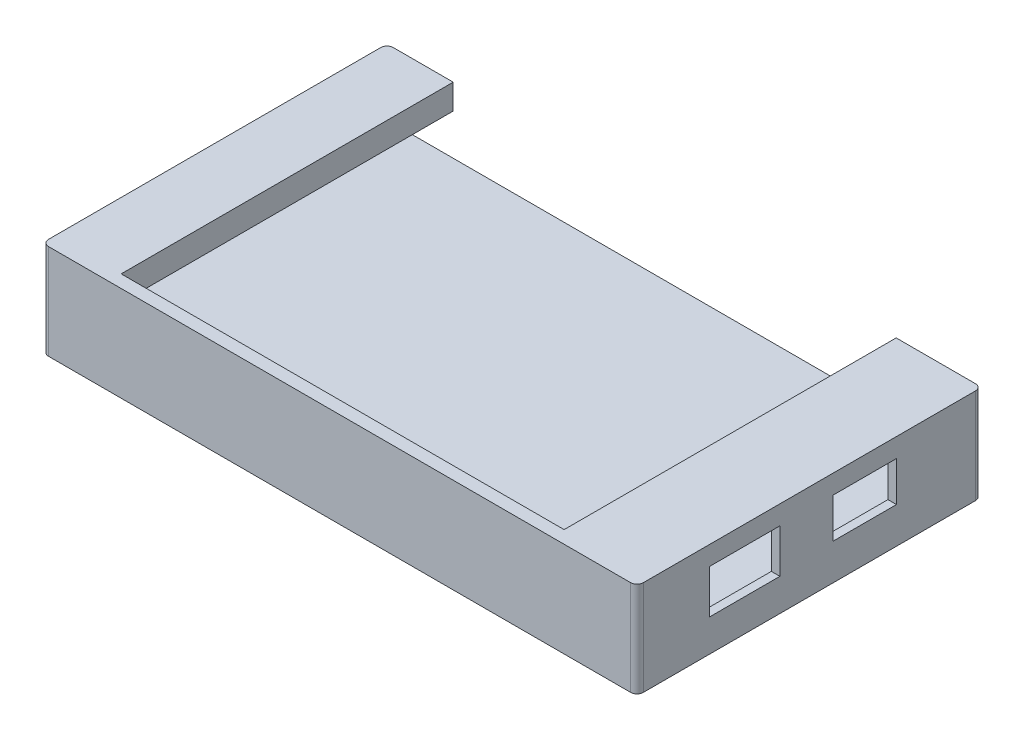
ISO-10303-21;
HEADER;
FILE_DESCRIPTION(('STEP AP214'),'2;1');
FILE_NAME('part.step','',(''),(''),'','','');
FILE_SCHEMA(('AUTOMOTIVE_DESIGN { 1 0 10303 214 1 1 1 1 }'));
ENDSEC;
DATA;
#1=APPLICATION_CONTEXT('core data for automotive mechanical design processes');
#2=APPLICATION_PROTOCOL_DEFINITION('international standard','automotive_design',2000,#1);
#3=PRODUCT_CONTEXT('',#1,'mechanical');
#4=PRODUCT('Part','Part','',(#3));
#5=PRODUCT_RELATED_PRODUCT_CATEGORY('part','',(#4));
#6=PRODUCT_DEFINITION_FORMATION('','',#4);
#7=PRODUCT_DEFINITION_CONTEXT('part definition',#1,'design');
#8=PRODUCT_DEFINITION('design','',#6,#7);
#9=PRODUCT_DEFINITION_SHAPE('','',#8);
#10=(LENGTH_UNIT() NAMED_UNIT(*) SI_UNIT(.MILLI.,.METRE.));
#11=(NAMED_UNIT(*) PLANE_ANGLE_UNIT() SI_UNIT($,.RADIAN.));
#12=(NAMED_UNIT(*) SI_UNIT($,.STERADIAN.) SOLID_ANGLE_UNIT());
#13=UNCERTAINTY_MEASURE_WITH_UNIT(LENGTH_MEASURE(1.E-05),#10,'distance_accuracy_value','');
#14=(GEOMETRIC_REPRESENTATION_CONTEXT(3) GLOBAL_UNCERTAINTY_ASSIGNED_CONTEXT((#13)) GLOBAL_UNIT_ASSIGNED_CONTEXT((#10,
#11,#12)) REPRESENTATION_CONTEXT('',''));
#15=CARTESIAN_POINT('',(0.,0.,0.));
#16=DIRECTION('',(0.,0.,1.));
#17=DIRECTION('',(1.,0.,0.));
#18=AXIS2_PLACEMENT_3D('',#15,#16,#17);
#19=CARTESIAN_POINT('',(0.,2.,-52.4));
#20=DIRECTION('',(0.,0.,-1.));
#21=DIRECTION('',(-1.,0.,0.));
#22=AXIS2_PLACEMENT_3D('',#19,#20,#21);
#23=PLANE('',#22);
#24=DIRECTION('',(1.,0.,0.));
#25=VECTOR('',#24,1.);
#26=CARTESIAN_POINT('',(0.,0.,-52.4));
#27=LINE('',#26,#25);
#28=CARTESIAN_POINT('',(-0.999999999999997,0.,-52.4));
#29=VERTEX_POINT('',#28);
#30=CARTESIAN_POINT('',(90.85,0.,-52.4));
#31=VERTEX_POINT('',#30);
#32=EDGE_CURVE('E500',#29,#31,#27,.T.);
#33=ORIENTED_EDGE('',*,*,#32,.F.);
#34=DIRECTION('',(0.,-1.,0.));
#35=VECTOR('',#34,1.);
#36=CARTESIAN_POINT('',(-0.999999999999997,15.,-52.4));
#37=LINE('',#36,#35);
#38=CARTESIAN_POINT('',(-0.999999999999997,15.,-52.4));
#39=VERTEX_POINT('',#38);
#40=EDGE_CURVE('E563',#29,#39,#37,.F.);
#41=ORIENTED_EDGE('',*,*,#40,.T.);
#42=DIRECTION('',(-1.,0.,0.));
#43=VECTOR('',#42,1.);
#44=CARTESIAN_POINT('',(0.,15.,-52.4));
#45=LINE('',#44,#43);
#46=CARTESIAN_POINT('',(8.45,15.,-52.4));
#47=VERTEX_POINT('',#46);
#48=EDGE_CURVE('E460',#47,#39,#45,.T.);
#49=ORIENTED_EDGE('',*,*,#48,.F.);
#50=DIRECTION('',(0.,-1.,0.));
#51=VECTOR('',#50,1.);
#52=CARTESIAN_POINT('',(8.45,15.,-52.4));
#53=LINE('',#52,#51);
#54=CARTESIAN_POINT('',(8.45,11.05,-52.4));
#55=VERTEX_POINT('',#54);
#56=EDGE_CURVE('E493',#47,#55,#53,.T.);
#57=ORIENTED_EDGE('',*,*,#56,.T.);
#58=DIRECTION('',(1.,0.,0.));
#59=VECTOR('',#58,1.);
#60=CARTESIAN_POINT('',(8.45,11.05,-52.4));
#61=LINE('',#60,#59);
#62=CARTESIAN_POINT('',(0.,11.05,-52.4));
#63=VERTEX_POINT('',#62);
#64=EDGE_CURVE('E337',#63,#55,#61,.T.);
#65=ORIENTED_EDGE('',*,*,#64,.F.);
#66=DIRECTION('',(0.,-1.,0.));
#67=VECTOR('',#66,1.);
#68=CARTESIAN_POINT('',(0.,4.6,-52.4));
#69=LINE('',#68,#67);
#70=CARTESIAN_POINT('',(0.,4.6,-52.4));
#71=VERTEX_POINT('',#70);
#72=EDGE_CURVE('E278',#63,#71,#69,.T.);
#73=ORIENTED_EDGE('',*,*,#72,.T.);
#74=DIRECTION('',(1.,0.,0.));
#75=VECTOR('',#74,1.);
#76=CARTESIAN_POINT('',(0.,4.6,-52.4));
#77=LINE('',#76,#75);
#78=CARTESIAN_POINT('',(90.5,4.6,-52.4));
#79=VERTEX_POINT('',#78);
#80=EDGE_CURVE('E270',#71,#79,#77,.T.);
#81=ORIENTED_EDGE('',*,*,#80,.T.);
#82=DIRECTION('',(0.,-1.,0.));
#83=VECTOR('',#82,1.);
#84=CARTESIAN_POINT('',(90.5,4.6,-52.4));
#85=LINE('',#84,#83);
#86=CARTESIAN_POINT('',(90.5,11.05,-52.4));
#87=VERTEX_POINT('',#86);
#88=EDGE_CURVE('E275',#87,#79,#85,.T.);
#89=ORIENTED_EDGE('',*,*,#88,.F.);
#90=DIRECTION('',(1.,0.,0.));
#91=VECTOR('',#90,1.);
#92=CARTESIAN_POINT('',(78.35,11.05,-52.4));
#93=LINE('',#92,#91);
#94=CARTESIAN_POINT('',(78.35,11.05,-52.4));
#95=VERTEX_POINT('',#94);
#96=EDGE_CURVE('E342',#95,#87,#93,.T.);
#97=ORIENTED_EDGE('',*,*,#96,.F.);
#98=DIRECTION('',(0.,-1.,0.));
#99=VECTOR('',#98,1.);
#100=CARTESIAN_POINT('',(78.35,15.,-52.4));
#101=LINE('',#100,#99);
#102=CARTESIAN_POINT('',(78.35,15.,-52.4));
#103=VERTEX_POINT('',#102);
#104=EDGE_CURVE('E490',#103,#95,#101,.T.);
#105=ORIENTED_EDGE('',*,*,#104,.F.);
#106=DIRECTION('',(-1.,0.,0.));
#107=VECTOR('',#106,1.);
#108=CARTESIAN_POINT('',(0.,15.,-52.4));
#109=LINE('',#108,#107);
#110=CARTESIAN_POINT('',(90.85,15.,-52.4));
#111=VERTEX_POINT('',#110);
#112=EDGE_CURVE('E474',#111,#103,#109,.T.);
#113=ORIENTED_EDGE('',*,*,#112,.F.);
#114=DIRECTION('',(0.,-1.,0.));
#115=VECTOR('',#114,1.);
#116=CARTESIAN_POINT('',(90.85,2.,-52.4));
#117=LINE('',#116,#115);
#118=EDGE_CURVE('E559',#111,#31,#117,.T.);
#119=ORIENTED_EDGE('',*,*,#118,.T.);
#120=EDGE_LOOP('',(#33,#41,#49,#57,#65,#73,#81,#89,#97,#105,#113,#119));
#121=FACE_BOUND('',#120,.T.);
#122=ADVANCED_FACE('F71',(#121),#23,.T.);
#123=CARTESIAN_POINT('',(104.919812546475,0.,-20.55));
#124=DIRECTION('',(0.,0.,-1.));
#125=DIRECTION('',(-1.,0.,0.));
#126=AXIS2_PLACEMENT_3D('',#123,#124,#125);
#127=PLANE('',#126);
#128=DIRECTION('',(-1.,0.,0.));
#129=VECTOR('',#128,1.);
#130=CARTESIAN_POINT('',(104.919812546475,11.05,-20.55));
#131=LINE('',#130,#129);
#132=CARTESIAN_POINT('',(90.5,11.05,-20.55));
#133=VERTEX_POINT('',#132);
#134=CARTESIAN_POINT('',(86.,11.05,-20.55));
#135=VERTEX_POINT('',#134);
#136=EDGE_CURVE('E334',#133,#135,#131,.T.);
#137=ORIENTED_EDGE('',*,*,#136,.F.);
#138=DIRECTION('',(0.,-1.,0.));
#139=VECTOR('',#138,1.);
#140=CARTESIAN_POINT('',(90.5,0.,-20.55));
#141=LINE('',#140,#139);
#142=CARTESIAN_POINT('',(90.5,5.09,-20.55));
#143=VERTEX_POINT('',#142);
#144=EDGE_CURVE('E321',#133,#143,#141,.T.);
#145=ORIENTED_EDGE('',*,*,#144,.T.);
#146=DIRECTION('',(-1.,0.,0.));
#147=VECTOR('',#146,1.);
#148=CARTESIAN_POINT('',(104.919812546475,5.09,-20.55));
#149=LINE('',#148,#147);
#150=CARTESIAN_POINT('',(91.85,5.09,-20.55));
#151=VERTEX_POINT('',#150);
#152=EDGE_CURVE('E437',#151,#143,#149,.T.);
#153=ORIENTED_EDGE('',*,*,#152,.F.);
#154=DIRECTION('',(0.,-1.,0.));
#155=VECTOR('',#154,1.);
#156=CARTESIAN_POINT('',(91.85,0.,-20.55));
#157=LINE('',#156,#155);
#158=CARTESIAN_POINT('',(91.85,11.99,-20.55));
#159=VERTEX_POINT('',#158);
#160=EDGE_CURVE('E429',#159,#151,#157,.T.);
#161=ORIENTED_EDGE('',*,*,#160,.F.);
#162=DIRECTION('',(-1.,0.,0.));
#163=VECTOR('',#162,1.);
#164=CARTESIAN_POINT('',(104.919812546475,11.99,-20.55));
#165=LINE('',#164,#163);
#166=CARTESIAN_POINT('',(86.,11.99,-20.55));
#167=VERTEX_POINT('',#166);
#168=EDGE_CURVE('E423',#159,#167,#165,.T.);
#169=ORIENTED_EDGE('',*,*,#168,.T.);
#170=DIRECTION('',(0.,-1.,0.));
#171=VECTOR('',#170,1.);
#172=CARTESIAN_POINT('',(86.,0.,-20.55));
#173=LINE('',#172,#171);
#174=EDGE_CURVE('E425',#167,#135,#173,.T.);
#175=ORIENTED_EDGE('',*,*,#174,.T.);
#176=EDGE_LOOP('',(#137,#145,#153,#161,#169,#175));
#177=FACE_BOUND('',#176,.T.);
#178=ADVANCED_FACE('F621',(#177),#127,.F.);
#179=CARTESIAN_POINT('',(104.919812546475,5.09,0.));
#180=DIRECTION('',(0.,1.,0.));
#181=DIRECTION('',(0.,0.,1.));
#182=AXIS2_PLACEMENT_3D('',#179,#180,#181);
#183=PLANE('',#182);
#184=DIRECTION('',(0.,0.,-1.));
#185=VECTOR('',#184,1.);
#186=CARTESIAN_POINT('',(90.5,5.09,0.));
#187=LINE('',#186,#185);
#188=CARTESIAN_POINT('',(90.5,5.09,-9.45));
#189=VERTEX_POINT('',#188);
#190=EDGE_CURVE('E318',#189,#143,#187,.T.);
#191=ORIENTED_EDGE('',*,*,#190,.F.);
#192=DIRECTION('',(-1.,0.,0.));
#193=VECTOR('',#192,1.);
#194=CARTESIAN_POINT('',(104.919812546475,5.09,-9.45));
#195=LINE('',#194,#193);
#196=CARTESIAN_POINT('',(91.85,5.09,-9.45));
#197=VERTEX_POINT('',#196);
#198=EDGE_CURVE('E448',#197,#189,#195,.T.);
#199=ORIENTED_EDGE('',*,*,#198,.F.);
#200=DIRECTION('',(0.,0.,-1.));
#201=VECTOR('',#200,1.);
#202=CARTESIAN_POINT('',(91.85,5.09,0.));
#203=LINE('',#202,#201);
#204=EDGE_CURVE('E430',#197,#151,#203,.T.);
#205=ORIENTED_EDGE('',*,*,#204,.T.);
#206=ORIENTED_EDGE('',*,*,#152,.T.);
#207=EDGE_LOOP('',(#191,#199,#205,#206));
#208=FACE_BOUND('',#207,.T.);
#209=ADVANCED_FACE('F628',(#208),#183,.T.);
#210=CARTESIAN_POINT('',(104.919812546475,0.,-9.45));
#211=DIRECTION('',(0.,0.,-1.));
#212=DIRECTION('',(-1.,0.,0.));
#213=AXIS2_PLACEMENT_3D('',#210,#211,#212);
#214=PLANE('',#213);
#215=DIRECTION('',(0.,-1.,0.));
#216=VECTOR('',#215,1.);
#217=CARTESIAN_POINT('',(90.5,0.,-9.45));
#218=LINE('',#217,#216);
#219=CARTESIAN_POINT('',(90.5,11.05,-9.45000000000001));
#220=VERTEX_POINT('',#219);
#221=EDGE_CURVE('E315',#220,#189,#218,.T.);
#222=ORIENTED_EDGE('',*,*,#221,.F.);
#223=DIRECTION('',(-1.,0.,0.));
#224=VECTOR('',#223,1.);
#225=CARTESIAN_POINT('',(104.919812546475,11.05,-9.45));
#226=LINE('',#225,#224);
#227=CARTESIAN_POINT('',(86.,11.05,-9.45000000000001));
#228=VERTEX_POINT('',#227);
#229=EDGE_CURVE('E331',#220,#228,#226,.T.);
#230=ORIENTED_EDGE('',*,*,#229,.T.);
#231=DIRECTION('',(0.,-1.,0.));
#232=VECTOR('',#231,1.);
#233=CARTESIAN_POINT('',(86.,0.,-9.45));
#234=LINE('',#233,#232);
#235=CARTESIAN_POINT('',(86.,11.99,-9.45));
#236=VERTEX_POINT('',#235);
#237=EDGE_CURVE('E419',#236,#228,#234,.T.);
#238=ORIENTED_EDGE('',*,*,#237,.F.);
#239=DIRECTION('',(-1.,0.,0.));
#240=VECTOR('',#239,1.);
#241=CARTESIAN_POINT('',(104.919812546475,11.99,-9.45));
#242=LINE('',#241,#240);
#243=CARTESIAN_POINT('',(91.85,11.99,-9.45));
#244=VERTEX_POINT('',#243);
#245=EDGE_CURVE('E424',#244,#236,#242,.T.);
#246=ORIENTED_EDGE('',*,*,#245,.F.);
#247=DIRECTION('',(0.,-1.,0.));
#248=VECTOR('',#247,1.);
#249=CARTESIAN_POINT('',(91.85,0.,-9.45));
#250=LINE('',#249,#248);
#251=EDGE_CURVE('E440',#244,#197,#250,.T.);
#252=ORIENTED_EDGE('',*,*,#251,.T.);
#253=ORIENTED_EDGE('',*,*,#198,.T.);
#254=EDGE_LOOP('',(#222,#230,#238,#246,#252,#253));
#255=FACE_BOUND('',#254,.T.);
#256=ADVANCED_FACE('F708',(#255),#214,.T.);
#257=CARTESIAN_POINT('',(104.919812546475,0.,-28.95));
#258=DIRECTION('',(0.,0.,-1.));
#259=DIRECTION('',(-1.,0.,0.));
#260=AXIS2_PLACEMENT_3D('',#257,#258,#259);
#261=PLANE('',#260);
#262=DIRECTION('',(0.,-1.,0.));
#263=VECTOR('',#262,1.);
#264=CARTESIAN_POINT('',(90.5,0.,-28.95));
#265=LINE('',#264,#263);
#266=CARTESIAN_POINT('',(90.5,11.05,-28.95));
#267=VERTEX_POINT('',#266);
#268=CARTESIAN_POINT('',(90.5,5.7,-28.95));
#269=VERTEX_POINT('',#268);
#270=EDGE_CURVE('E312',#267,#269,#265,.T.);
#271=ORIENTED_EDGE('',*,*,#270,.F.);
#272=DIRECTION('',(-1.,0.,0.));
#273=VECTOR('',#272,1.);
#274=CARTESIAN_POINT('',(104.919812546475,11.05,-28.95));
#275=LINE('',#274,#273);
#276=CARTESIAN_POINT('',(86.,11.05,-28.95));
#277=VERTEX_POINT('',#276);
#278=EDGE_CURVE('E328',#267,#277,#275,.T.);
#279=ORIENTED_EDGE('',*,*,#278,.T.);
#280=DIRECTION('',(0.,-1.,0.));
#281=VECTOR('',#280,1.);
#282=CARTESIAN_POINT('',(86.,0.,-28.95));
#283=LINE('',#282,#281);
#284=CARTESIAN_POINT('',(86.,11.99,-28.95));
#285=VERTEX_POINT('',#284);
#286=EDGE_CURVE('E385',#285,#277,#283,.T.);
#287=ORIENTED_EDGE('',*,*,#286,.F.);
#288=DIRECTION('',(-1.,0.,0.));
#289=VECTOR('',#288,1.);
#290=CARTESIAN_POINT('',(104.919812546475,11.99,-28.95));
#291=LINE('',#290,#289);
#292=CARTESIAN_POINT('',(91.85,11.99,-28.95));
#293=VERTEX_POINT('',#292);
#294=EDGE_CURVE('E390',#293,#285,#291,.T.);
#295=ORIENTED_EDGE('',*,*,#294,.F.);
#296=DIRECTION('',(0.,-1.,0.));
#297=VECTOR('',#296,1.);
#298=CARTESIAN_POINT('',(91.85,0.,-28.95));
#299=LINE('',#298,#297);
#300=CARTESIAN_POINT('',(91.85,5.7,-28.95));
#301=VERTEX_POINT('',#300);
#302=EDGE_CURVE('E400',#293,#301,#299,.T.);
#303=ORIENTED_EDGE('',*,*,#302,.T.);
#304=DIRECTION('',(-1.,0.,0.));
#305=VECTOR('',#304,1.);
#306=CARTESIAN_POINT('',(104.919812546475,5.7,-28.95));
#307=LINE('',#306,#305);
#308=EDGE_CURVE('E396',#301,#269,#307,.T.);
#309=ORIENTED_EDGE('',*,*,#308,.T.);
#310=EDGE_LOOP('',(#271,#279,#287,#295,#303,#309));
#311=FACE_BOUND('',#310,.T.);
#312=ADVANCED_FACE('F718',(#311),#261,.T.);
#313=CARTESIAN_POINT('',(104.919812546475,5.7,0.));
#314=DIRECTION('',(0.,-1.,0.));
#315=DIRECTION('',(0.,0.,-1.));
#316=AXIS2_PLACEMENT_3D('',#313,#314,#315);
#317=PLANE('',#316);
#318=DIRECTION('',(-1.,0.,0.));
#319=VECTOR('',#318,1.);
#320=CARTESIAN_POINT('',(104.919812546475,5.7,-38.95));
#321=LINE('',#320,#319);
#322=CARTESIAN_POINT('',(91.85,5.7,-38.95));
#323=VERTEX_POINT('',#322);
#324=CARTESIAN_POINT('',(90.5,5.7,-38.95));
#325=VERTEX_POINT('',#324);
#326=EDGE_CURVE('E395',#323,#325,#321,.T.);
#327=ORIENTED_EDGE('',*,*,#326,.T.);
#328=DIRECTION('',(0.,0.,1.));
#329=VECTOR('',#328,1.);
#330=CARTESIAN_POINT('',(90.5,5.7,0.));
#331=LINE('',#330,#329);
#332=EDGE_CURVE('E307',#325,#269,#331,.T.);
#333=ORIENTED_EDGE('',*,*,#332,.T.);
#334=ORIENTED_EDGE('',*,*,#308,.F.);
#335=DIRECTION('',(0.,0.,1.));
#336=VECTOR('',#335,1.);
#337=CARTESIAN_POINT('',(91.85,5.7,0.));
#338=LINE('',#337,#336);
#339=EDGE_CURVE('E389',#323,#301,#338,.T.);
#340=ORIENTED_EDGE('',*,*,#339,.F.);
#341=EDGE_LOOP('',(#327,#333,#334,#340));
#342=FACE_BOUND('',#341,.T.);
#343=ADVANCED_FACE('F728',(#342),#317,.F.);
#344=CARTESIAN_POINT('',(104.919812546475,0.,-38.95));
#345=DIRECTION('',(0.,0.,-1.));
#346=DIRECTION('',(-1.,0.,0.));
#347=AXIS2_PLACEMENT_3D('',#344,#345,#346);
#348=PLANE('',#347);
#349=DIRECTION('',(-1.,0.,0.));
#350=VECTOR('',#349,1.);
#351=CARTESIAN_POINT('',(104.919812546475,11.05,-38.95));
#352=LINE('',#351,#350);
#353=CARTESIAN_POINT('',(90.5,11.05,-38.95));
#354=VERTEX_POINT('',#353);
#355=CARTESIAN_POINT('',(86.,11.05,-38.95));
#356=VERTEX_POINT('',#355);
#357=EDGE_CURVE('E325',#354,#356,#352,.T.);
#358=ORIENTED_EDGE('',*,*,#357,.F.);
#359=DIRECTION('',(0.,-1.,0.));
#360=VECTOR('',#359,1.);
#361=CARTESIAN_POINT('',(90.5,0.,-38.95));
#362=LINE('',#361,#360);
#363=EDGE_CURVE('E512',#354,#325,#362,.T.);
#364=ORIENTED_EDGE('',*,*,#363,.T.);
#365=ORIENTED_EDGE('',*,*,#326,.F.);
#366=DIRECTION('',(0.,-1.,0.));
#367=VECTOR('',#366,1.);
#368=CARTESIAN_POINT('',(91.85,0.,-38.95));
#369=LINE('',#368,#367);
#370=CARTESIAN_POINT('',(91.85,11.99,-38.95));
#371=VERTEX_POINT('',#370);
#372=EDGE_CURVE('E391',#371,#323,#369,.T.);
#373=ORIENTED_EDGE('',*,*,#372,.F.);
#374=DIRECTION('',(-1.,0.,0.));
#375=VECTOR('',#374,1.);
#376=CARTESIAN_POINT('',(104.919812546475,11.99,-38.95));
#377=LINE('',#376,#375);
#378=CARTESIAN_POINT('',(86.,11.99,-38.95));
#379=VERTEX_POINT('',#378);
#380=EDGE_CURVE('E384',#371,#379,#377,.T.);
#381=ORIENTED_EDGE('',*,*,#380,.T.);
#382=DIRECTION('',(0.,-1.,0.));
#383=VECTOR('',#382,1.);
#384=CARTESIAN_POINT('',(86.,0.,-38.95));
#385=LINE('',#384,#383);
#386=EDGE_CURVE('E375',#379,#356,#385,.T.);
#387=ORIENTED_EDGE('',*,*,#386,.T.);
#388=EDGE_LOOP('',(#358,#364,#365,#373,#381,#387));
#389=FACE_BOUND('',#388,.T.);
#390=ADVANCED_FACE('F738',(#389),#348,.F.);
#391=CARTESIAN_POINT('',(0.,12.,0.));
#392=DIRECTION('',(0.,0.,-1.));
#393=DIRECTION('',(-1.,0.,0.));
#394=AXIS2_PLACEMENT_3D('',#391,#392,#393);
#395=PLANE('',#394);
#396=DIRECTION('',(-1.,0.,0.));
#397=VECTOR('',#396,1.);
#398=CARTESIAN_POINT('',(78.35,11.05,0.));
#399=LINE('',#398,#397);
#400=CARTESIAN_POINT('',(88.5,11.05,0.));
#401=VERTEX_POINT('',#400);
#402=CARTESIAN_POINT('',(78.35,11.05,0.));
#403=VERTEX_POINT('',#402);
#404=EDGE_CURVE('E283',#401,#403,#399,.T.);
#405=ORIENTED_EDGE('',*,*,#404,.F.);
#406=DIRECTION('',(0.,1.,0.));
#407=VECTOR('',#406,1.);
#408=CARTESIAN_POINT('',(88.5,12.,0.));
#409=LINE('',#408,#407);
#410=CARTESIAN_POINT('',(88.5,4.6,0.));
#411=VERTEX_POINT('',#410);
#412=EDGE_CURVE('E525',#401,#411,#409,.F.);
#413=ORIENTED_EDGE('',*,*,#412,.T.);
#414=DIRECTION('',(1.,0.,0.));
#415=VECTOR('',#414,1.);
#416=CARTESIAN_POINT('',(0.,4.6,0.));
#417=LINE('',#416,#415);
#418=CARTESIAN_POINT('',(2.,4.6,0.));
#419=VERTEX_POINT('',#418);
#420=EDGE_CURVE('E371',#419,#411,#417,.T.);
#421=ORIENTED_EDGE('',*,*,#420,.F.);
#422=DIRECTION('',(0.,-1.,0.));
#423=VECTOR('',#422,1.);
#424=CARTESIAN_POINT('',(2.,12.,0.));
#425=LINE('',#424,#423);
#426=CARTESIAN_POINT('',(2.,11.05,0.));
#427=VERTEX_POINT('',#426);
#428=EDGE_CURVE('E522',#419,#427,#425,.F.);
#429=ORIENTED_EDGE('',*,*,#428,.T.);
#430=DIRECTION('',(-1.,0.,0.));
#431=VECTOR('',#430,1.);
#432=CARTESIAN_POINT('',(8.45,11.05,0.));
#433=LINE('',#432,#431);
#434=CARTESIAN_POINT('',(8.45,11.05,0.));
#435=VERTEX_POINT('',#434);
#436=EDGE_CURVE('E359',#435,#427,#433,.T.);
#437=ORIENTED_EDGE('',*,*,#436,.F.);
#438=DIRECTION('',(0.,-1.,0.));
#439=VECTOR('',#438,1.);
#440=CARTESIAN_POINT('',(8.45000000000001,15.,0.));
#441=LINE('',#440,#439);
#442=CARTESIAN_POINT('',(8.45000000000001,15.,0.));
#443=VERTEX_POINT('',#442);
#444=EDGE_CURVE('E483',#443,#435,#441,.T.);
#445=ORIENTED_EDGE('',*,*,#444,.F.);
#446=DIRECTION('',(-1.,0.,0.));
#447=VECTOR('',#446,1.);
#448=CARTESIAN_POINT('',(0.,15.,0.));
#449=LINE('',#448,#447);
#450=CARTESIAN_POINT('',(78.35,15.,0.));
#451=VERTEX_POINT('',#450);
#452=EDGE_CURVE('E480',#451,#443,#449,.T.);
#453=ORIENTED_EDGE('',*,*,#452,.F.);
#454=DIRECTION('',(0.,-1.,0.));
#455=VECTOR('',#454,1.);
#456=CARTESIAN_POINT('',(78.35,15.,0.));
#457=LINE('',#456,#455);
#458=EDGE_CURVE('E486',#451,#403,#457,.T.);
#459=ORIENTED_EDGE('',*,*,#458,.T.);
#460=EDGE_LOOP('',(#405,#413,#421,#429,#437,#445,#453,#459));
#461=FACE_BOUND('',#460,.T.);
#462=ADVANCED_FACE('F748',(#461),#395,.T.);
#463=CARTESIAN_POINT('',(0.,12.,0.));
#464=DIRECTION('',(-1.,0.,0.));
#465=DIRECTION('',(0.,0.,1.));
#466=AXIS2_PLACEMENT_3D('',#463,#464,#465);
#467=PLANE('',#466);
#468=DIRECTION('',(0.,0.,-1.));
#469=VECTOR('',#468,1.);
#470=CARTESIAN_POINT('',(0.,11.05,-52.4));
#471=LINE('',#470,#469);
#472=CARTESIAN_POINT('',(0.,11.05,-2.00000000000002));
#473=VERTEX_POINT('',#472);
#474=EDGE_CURVE('E356',#473,#63,#471,.T.);
#475=ORIENTED_EDGE('',*,*,#474,.F.);
#476=DIRECTION('',(0.,-1.,0.));
#477=VECTOR('',#476,1.);
#478=CARTESIAN_POINT('',(0.,12.,-2.));
#479=LINE('',#478,#477);
#480=CARTESIAN_POINT('',(0.,4.6,-2.));
#481=VERTEX_POINT('',#480);
#482=EDGE_CURVE('E533',#473,#481,#479,.T.);
#483=ORIENTED_EDGE('',*,*,#482,.T.);
#484=DIRECTION('',(0.,0.,1.));
#485=VECTOR('',#484,1.);
#486=CARTESIAN_POINT('',(0.,4.6,0.));
#487=LINE('',#486,#485);
#488=EDGE_CURVE('E368',#71,#481,#487,.T.);
#489=ORIENTED_EDGE('',*,*,#488,.F.);
#490=ORIENTED_EDGE('',*,*,#72,.F.);
#491=EDGE_LOOP('',(#475,#483,#489,#490));
#492=FACE_BOUND('',#491,.T.);
#493=ADVANCED_FACE('F635',(#492),#467,.F.);
#494=CARTESIAN_POINT('',(91.85,2.,0.));
#495=DIRECTION('',(1.,0.,0.));
#496=DIRECTION('',(0.,0.,-1.));
#497=AXIS2_PLACEMENT_3D('',#494,#495,#496);
#498=PLANE('',#497);
#499=ORIENTED_EDGE('',*,*,#160,.T.);
#500=ORIENTED_EDGE('',*,*,#204,.F.);
#501=ORIENTED_EDGE('',*,*,#251,.F.);
#502=DIRECTION('',(0.,0.,1.));
#503=VECTOR('',#502,1.);
#504=CARTESIAN_POINT('',(91.85,11.99,0.));
#505=LINE('',#504,#503);
#506=EDGE_CURVE('E374',#159,#244,#505,.T.);
#507=ORIENTED_EDGE('',*,*,#506,.F.);
#508=EDGE_LOOP('',(#499,#500,#501,#507));
#509=FACE_BOUND('',#508,.T.);
#510=DIRECTION('',(0.,0.,1.));
#511=VECTOR('',#510,1.);
#512=CARTESIAN_POINT('',(91.85,0.,0.));
#513=LINE('',#512,#511);
#514=CARTESIAN_POINT('',(91.85,0.,-51.4));
#515=VERTEX_POINT('',#514);
#516=CARTESIAN_POINT('',(91.85,0.,1.));
#517=VERTEX_POINT('',#516);
#518=EDGE_CURVE('E496',#515,#517,#513,.T.);
#519=ORIENTED_EDGE('',*,*,#518,.F.);
#520=DIRECTION('',(0.,-1.,0.));
#521=VECTOR('',#520,1.);
#522=CARTESIAN_POINT('',(91.85,2.,-51.4));
#523=LINE('',#522,#521);
#524=CARTESIAN_POINT('',(91.85,15.,-51.4));
#525=VERTEX_POINT('',#524);
#526=EDGE_CURVE('E87',#515,#525,#523,.F.);
#527=ORIENTED_EDGE('',*,*,#526,.T.);
#528=DIRECTION('',(0.,0.,-1.));
#529=VECTOR('',#528,1.);
#530=CARTESIAN_POINT('',(91.85,15.,0.));
#531=LINE('',#530,#529);
#532=CARTESIAN_POINT('',(91.85,15.,1.));
#533=VERTEX_POINT('',#532);
#534=EDGE_CURVE('E471',#533,#525,#531,.T.);
#535=ORIENTED_EDGE('',*,*,#534,.F.);
#536=DIRECTION('',(0.,-1.,0.));
#537=VECTOR('',#536,1.);
#538=CARTESIAN_POINT('',(91.85,0.,1.));
#539=LINE('',#538,#537);
#540=EDGE_CURVE('E577',#533,#517,#539,.T.);
#541=ORIENTED_EDGE('',*,*,#540,.T.);
#542=EDGE_LOOP('',(#519,#527,#535,#541));
#543=FACE_BOUND('',#542,.T.);
#544=ORIENTED_EDGE('',*,*,#339,.T.);
#545=ORIENTED_EDGE('',*,*,#302,.F.);
#546=DIRECTION('',(0.,0.,1.));
#547=VECTOR('',#546,1.);
#548=CARTESIAN_POINT('',(91.85,11.99,0.));
#549=LINE('',#548,#547);
#550=EDGE_CURVE('E379',#371,#293,#549,.T.);
#551=ORIENTED_EDGE('',*,*,#550,.F.);
#552=ORIENTED_EDGE('',*,*,#372,.T.);
#553=EDGE_LOOP('',(#544,#545,#551,#552));
#554=FACE_BOUND('',#553,.T.);
#555=ADVANCED_FACE('F598',(#509,#543,#554),#498,.T.);
#556=CARTESIAN_POINT('',(-2.,2.,0.));
#557=DIRECTION('',(1.,0.,0.));
#558=DIRECTION('',(0.,0.,-1.));
#559=AXIS2_PLACEMENT_3D('',#556,#557,#558);
#560=PLANE('',#559);
#561=DIRECTION('',(0.,0.,1.));
#562=VECTOR('',#561,1.);
#563=CARTESIAN_POINT('',(-2.,15.,0.));
#564=LINE('',#563,#562);
#565=CARTESIAN_POINT('',(-2.,15.,-51.4));
#566=VERTEX_POINT('',#565);
#567=CARTESIAN_POINT('',(-2.,15.,1.));
#568=VERTEX_POINT('',#567);
#569=EDGE_CURVE('E464',#566,#568,#564,.T.);
#570=ORIENTED_EDGE('',*,*,#569,.F.);
#571=DIRECTION('',(0.,-1.,0.));
#572=VECTOR('',#571,1.);
#573=CARTESIAN_POINT('',(-2.,0.,-51.4));
#574=LINE('',#573,#572);
#575=CARTESIAN_POINT('',(-2.,0.,-51.4));
#576=VERTEX_POINT('',#575);
#577=EDGE_CURVE('E543',#566,#576,#574,.T.);
#578=ORIENTED_EDGE('',*,*,#577,.T.);
#579=DIRECTION('',(0.,0.,1.));
#580=VECTOR('',#579,1.);
#581=CARTESIAN_POINT('',(-2.,0.,0.));
#582=LINE('',#581,#580);
#583=CARTESIAN_POINT('',(-2.,0.,1.));
#584=VERTEX_POINT('',#583);
#585=EDGE_CURVE('E504',#576,#584,#582,.T.);
#586=ORIENTED_EDGE('',*,*,#585,.T.);
#587=DIRECTION('',(0.,-1.,0.));
#588=VECTOR('',#587,1.);
#589=CARTESIAN_POINT('',(-2.,2.,1.));
#590=LINE('',#589,#588);
#591=EDGE_CURVE('E540',#584,#568,#590,.F.);
#592=ORIENTED_EDGE('',*,*,#591,.T.);
#593=EDGE_LOOP('',(#570,#578,#586,#592));
#594=FACE_BOUND('',#593,.T.);
#595=ADVANCED_FACE('F614',(#594),#560,.F.);
#596=CARTESIAN_POINT('',(0.,2.,2.));
#597=DIRECTION('',(0.,0.,-1.));
#598=DIRECTION('',(-1.,0.,0.));
#599=AXIS2_PLACEMENT_3D('',#596,#597,#598);
#600=PLANE('',#599);
#601=DIRECTION('',(1.,0.,0.));
#602=VECTOR('',#601,1.);
#603=CARTESIAN_POINT('',(0.,0.,2.));
#604=LINE('',#603,#602);
#605=CARTESIAN_POINT('',(-0.999999999999997,0.,2.));
#606=VERTEX_POINT('',#605);
#607=CARTESIAN_POINT('',(90.85,0.,2.));
#608=VERTEX_POINT('',#607);
#609=EDGE_CURVE('E508',#606,#608,#604,.T.);
#610=ORIENTED_EDGE('',*,*,#609,.T.);
#611=DIRECTION('',(0.,-1.,0.));
#612=VECTOR('',#611,1.);
#613=CARTESIAN_POINT('',(90.85,15.,2.));
#614=LINE('',#613,#612);
#615=CARTESIAN_POINT('',(90.85,15.,2.));
#616=VERTEX_POINT('',#615);
#617=EDGE_CURVE('E12',#608,#616,#614,.F.);
#618=ORIENTED_EDGE('',*,*,#617,.T.);
#619=DIRECTION('',(1.,0.,0.));
#620=VECTOR('',#619,1.);
#621=CARTESIAN_POINT('',(0.,15.,2.));
#622=LINE('',#621,#620);
#623=CARTESIAN_POINT('',(-0.999999999999997,15.,2.));
#624=VERTEX_POINT('',#623);
#625=EDGE_CURVE('E468',#624,#616,#622,.T.);
#626=ORIENTED_EDGE('',*,*,#625,.F.);
#627=DIRECTION('',(0.,-1.,0.));
#628=VECTOR('',#627,1.);
#629=CARTESIAN_POINT('',(-0.999999999999997,2.,2.));
#630=LINE('',#629,#628);
#631=EDGE_CURVE('E80',#624,#606,#630,.T.);
#632=ORIENTED_EDGE('',*,*,#631,.T.);
#633=EDGE_LOOP('',(#610,#618,#626,#632));
#634=FACE_BOUND('',#633,.T.);
#635=ADVANCED_FACE('F588',(#634),#600,.F.);
#636=CARTESIAN_POINT('',(0.,0.,0.));
#637=DIRECTION('',(0.,1.,0.));
#638=DIRECTION('',(0.,0.,1.));
#639=AXIS2_PLACEMENT_3D('',#636,#637,#638);
#640=PLANE('',#639);
#641=ORIENTED_EDGE('',*,*,#585,.F.);
#642=CARTESIAN_POINT('',(-0.999999999999997,0.,-51.4));
#643=DIRECTION('',(0.,1.,0.));
#644=DIRECTION('',(0.,0.,1.));
#645=AXIS2_PLACEMENT_3D('',#642,#643,#644);
#646=CIRCLE('',#645,1.);
#647=EDGE_CURVE('E556',#576,#29,#646,.F.);
#648=ORIENTED_EDGE('',*,*,#647,.T.);
#649=ORIENTED_EDGE('',*,*,#32,.T.);
#650=CARTESIAN_POINT('',(90.85,0.,-51.4));
#651=DIRECTION('',(0.,1.,0.));
#652=DIRECTION('',(0.,0.,1.));
#653=AXIS2_PLACEMENT_3D('',#650,#651,#652);
#654=CIRCLE('',#653,1.);
#655=EDGE_CURVE('E553',#31,#515,#654,.F.);
#656=ORIENTED_EDGE('',*,*,#655,.T.);
#657=ORIENTED_EDGE('',*,*,#518,.T.);
#658=CARTESIAN_POINT('',(90.85,0.,1.));
#659=DIRECTION('',(0.,1.,0.));
#660=DIRECTION('',(0.,0.,1.));
#661=AXIS2_PLACEMENT_3D('',#658,#659,#660);
#662=CIRCLE('',#661,1.);
#663=EDGE_CURVE('E550',#517,#608,#662,.F.);
#664=ORIENTED_EDGE('',*,*,#663,.T.);
#665=ORIENTED_EDGE('',*,*,#609,.F.);
#666=CARTESIAN_POINT('',(-0.999999999999997,0.,1.));
#667=DIRECTION('',(0.,1.,0.));
#668=DIRECTION('',(0.,0.,1.));
#669=AXIS2_PLACEMENT_3D('',#666,#667,#668);
#670=CIRCLE('',#669,1.);
#671=EDGE_CURVE('E547',#606,#584,#670,.F.);
#672=ORIENTED_EDGE('',*,*,#671,.T.);
#673=EDGE_LOOP('',(#641,#648,#649,#656,#657,#664,#665,#672));
#674=FACE_BOUND('',#673,.T.);
#675=ADVANCED_FACE('F594',(#674),#640,.F.);
#676=CARTESIAN_POINT('',(8.45000000000001,15.,0.));
#677=DIRECTION('',(1.,0.,0.));
#678=DIRECTION('',(0.,0.,-1.));
#679=AXIS2_PLACEMENT_3D('',#676,#677,#678);
#680=PLANE('',#679);
#681=ORIENTED_EDGE('',*,*,#444,.T.);
#682=DIRECTION('',(0.,0.,1.));
#683=VECTOR('',#682,1.);
#684=CARTESIAN_POINT('',(8.45,11.05,-52.4));
#685=LINE('',#684,#683);
#686=EDGE_CURVE('E343',#55,#435,#685,.T.);
#687=ORIENTED_EDGE('',*,*,#686,.F.);
#688=ORIENTED_EDGE('',*,*,#56,.F.);
#689=DIRECTION('',(0.,0.,1.));
#690=VECTOR('',#689,1.);
#691=CARTESIAN_POINT('',(8.45000000000001,15.,0.));
#692=LINE('',#691,#690);
#693=EDGE_CURVE('E404',#47,#443,#692,.T.);
#694=ORIENTED_EDGE('',*,*,#693,.T.);
#695=EDGE_LOOP('',(#681,#687,#688,#694));
#696=FACE_BOUND('',#695,.T.);
#697=ADVANCED_FACE('F862',(#696),#680,.T.);
#698=CARTESIAN_POINT('',(78.35,15.,0.));
#699=DIRECTION('',(1.,0.,0.));
#700=DIRECTION('',(0.,0.,-1.));
#701=AXIS2_PLACEMENT_3D('',#698,#699,#700);
#702=PLANE('',#701);
#703=ORIENTED_EDGE('',*,*,#104,.T.);
#704=DIRECTION('',(0.,0.,-1.));
#705=VECTOR('',#704,1.);
#706=CARTESIAN_POINT('',(78.35,11.05,-52.4));
#707=LINE('',#706,#705);
#708=EDGE_CURVE('E338',#403,#95,#707,.T.);
#709=ORIENTED_EDGE('',*,*,#708,.F.);
#710=ORIENTED_EDGE('',*,*,#458,.F.);
#711=DIRECTION('',(0.,0.,1.));
#712=VECTOR('',#711,1.);
#713=CARTESIAN_POINT('',(78.35,15.,0.));
#714=LINE('',#713,#712);
#715=EDGE_CURVE('E477',#103,#451,#714,.T.);
#716=ORIENTED_EDGE('',*,*,#715,.F.);
#717=EDGE_LOOP('',(#703,#709,#710,#716));
#718=FACE_BOUND('',#717,.T.);
#719=ADVANCED_FACE('F853',(#718),#702,.F.);
#720=CARTESIAN_POINT('',(0.,15.,0.));
#721=DIRECTION('',(0.,1.,0.));
#722=DIRECTION('',(0.,0.,1.));
#723=AXIS2_PLACEMENT_3D('',#720,#721,#722);
#724=PLANE('',#723);
#725=ORIENTED_EDGE('',*,*,#48,.T.);
#726=CARTESIAN_POINT('',(-0.999999999999997,15.,-51.4));
#727=DIRECTION('',(0.,1.,0.));
#728=DIRECTION('',(0.,0.,1.));
#729=AXIS2_PLACEMENT_3D('',#726,#727,#728);
#730=CIRCLE('',#729,1.);
#731=EDGE_CURVE('E574',#39,#566,#730,.T.);
#732=ORIENTED_EDGE('',*,*,#731,.T.);
#733=ORIENTED_EDGE('',*,*,#569,.T.);
#734=CARTESIAN_POINT('',(-0.999999999999997,15.,1.));
#735=DIRECTION('',(0.,1.,0.));
#736=DIRECTION('',(0.,0.,1.));
#737=AXIS2_PLACEMENT_3D('',#734,#735,#736);
#738=CIRCLE('',#737,1.);
#739=EDGE_CURVE('E566',#568,#624,#738,.T.);
#740=ORIENTED_EDGE('',*,*,#739,.T.);
#741=ORIENTED_EDGE('',*,*,#625,.T.);
#742=CARTESIAN_POINT('',(90.85,15.,1.));
#743=DIRECTION('',(0.,1.,0.));
#744=DIRECTION('',(0.,0.,1.));
#745=AXIS2_PLACEMENT_3D('',#742,#743,#744);
#746=CIRCLE('',#745,1.);
#747=EDGE_CURVE('E94',#616,#533,#746,.T.);
#748=ORIENTED_EDGE('',*,*,#747,.T.);
#749=ORIENTED_EDGE('',*,*,#534,.T.);
#750=CARTESIAN_POINT('',(90.85,15.,-51.4));
#751=DIRECTION('',(0.,1.,0.));
#752=DIRECTION('',(0.,0.,1.));
#753=AXIS2_PLACEMENT_3D('',#750,#751,#752);
#754=CIRCLE('',#753,1.);
#755=EDGE_CURVE('E571',#525,#111,#754,.T.);
#756=ORIENTED_EDGE('',*,*,#755,.T.);
#757=ORIENTED_EDGE('',*,*,#112,.T.);
#758=ORIENTED_EDGE('',*,*,#715,.T.);
#759=ORIENTED_EDGE('',*,*,#452,.T.);
#760=ORIENTED_EDGE('',*,*,#693,.F.);
#761=EDGE_LOOP('',(#725,#732,#733,#740,#741,#748,#749,#756,#757,#758,#759,#760));
#762=FACE_BOUND('',#761,.T.);
#763=ADVANCED_FACE('F601',(#762),#724,.T.);
#764=CARTESIAN_POINT('',(104.919812546475,11.99,0.));
#765=DIRECTION('',(0.,-1.,0.));
#766=DIRECTION('',(0.,0.,-1.));
#767=AXIS2_PLACEMENT_3D('',#764,#765,#766);
#768=PLANE('',#767);
#769=ORIENTED_EDGE('',*,*,#506,.T.);
#770=ORIENTED_EDGE('',*,*,#245,.T.);
#771=DIRECTION('',(0.,0.,1.));
#772=VECTOR('',#771,1.);
#773=CARTESIAN_POINT('',(86.,11.99,0.));
#774=LINE('',#773,#772);
#775=EDGE_CURVE('E418',#167,#236,#774,.T.);
#776=ORIENTED_EDGE('',*,*,#775,.F.);
#777=ORIENTED_EDGE('',*,*,#168,.F.);
#778=EDGE_LOOP('',(#769,#770,#776,#777));
#779=FACE_BOUND('',#778,.T.);
#780=ADVANCED_FACE('F828',(#779),#768,.T.);
#781=CARTESIAN_POINT('',(104.919812546475,11.99,0.));
#782=DIRECTION('',(0.,-1.,0.));
#783=DIRECTION('',(0.,0.,-1.));
#784=AXIS2_PLACEMENT_3D('',#781,#782,#783);
#785=PLANE('',#784);
#786=ORIENTED_EDGE('',*,*,#550,.T.);
#787=ORIENTED_EDGE('',*,*,#294,.T.);
#788=DIRECTION('',(0.,0.,1.));
#789=VECTOR('',#788,1.);
#790=CARTESIAN_POINT('',(86.,11.99,0.));
#791=LINE('',#790,#789);
#792=EDGE_CURVE('E380',#379,#285,#791,.T.);
#793=ORIENTED_EDGE('',*,*,#792,.F.);
#794=ORIENTED_EDGE('',*,*,#380,.F.);
#795=EDGE_LOOP('',(#786,#787,#793,#794));
#796=FACE_BOUND('',#795,.T.);
#797=ADVANCED_FACE('F807',(#796),#785,.T.);
#798=CARTESIAN_POINT('',(0.,4.6,0.));
#799=DIRECTION('',(0.,-1.,0.));
#800=DIRECTION('',(0.,0.,-1.));
#801=AXIS2_PLACEMENT_3D('',#798,#799,#800);
#802=PLANE('',#801);
#803=ORIENTED_EDGE('',*,*,#420,.T.);
#804=CARTESIAN_POINT('',(88.5,4.6,-2.));
#805=DIRECTION('',(0.,-1.,0.));
#806=DIRECTION('',(0.,0.,-1.));
#807=AXIS2_PLACEMENT_3D('',#804,#805,#806);
#808=CIRCLE('',#807,2.);
#809=CARTESIAN_POINT('',(90.5,4.6,-2.00000000000002));
#810=VERTEX_POINT('',#809);
#811=EDGE_CURVE('E290',#411,#810,#808,.F.);
#812=ORIENTED_EDGE('',*,*,#811,.T.);
#813=DIRECTION('',(0.,0.,1.));
#814=VECTOR('',#813,1.);
#815=CARTESIAN_POINT('',(90.5,4.6,-52.4));
#816=LINE('',#815,#814);
#817=EDGE_CURVE('E286',#79,#810,#816,.T.);
#818=ORIENTED_EDGE('',*,*,#817,.F.);
#819=ORIENTED_EDGE('',*,*,#80,.F.);
#820=ORIENTED_EDGE('',*,*,#488,.T.);
#821=CARTESIAN_POINT('',(2.,4.6,-2.));
#822=DIRECTION('',(0.,-1.,0.));
#823=DIRECTION('',(0.,0.,-1.));
#824=AXIS2_PLACEMENT_3D('',#821,#822,#823);
#825=CIRCLE('',#824,2.);
#826=EDGE_CURVE('E528',#481,#419,#825,.F.);
#827=ORIENTED_EDGE('',*,*,#826,.T.);
#828=EDGE_LOOP('',(#803,#812,#818,#819,#820,#827));
#829=FACE_BOUND('',#828,.T.);
#830=ADVANCED_FACE('F288',(#829),#802,.F.);
#831=CARTESIAN_POINT('',(86.,11.05,-52.4));
#832=DIRECTION('',(-1.,0.,0.));
#833=DIRECTION('',(0.,0.,1.));
#834=AXIS2_PLACEMENT_3D('',#831,#832,#833);
#835=PLANE('',#834);
#836=DIRECTION('',(0.,0.,1.));
#837=VECTOR('',#836,1.);
#838=CARTESIAN_POINT('',(86.,11.05,-52.4));
#839=LINE('',#838,#837);
#840=EDGE_CURVE('E346',#135,#228,#839,.T.);
#841=ORIENTED_EDGE('',*,*,#840,.F.);
#842=ORIENTED_EDGE('',*,*,#174,.F.);
#843=ORIENTED_EDGE('',*,*,#775,.T.);
#844=ORIENTED_EDGE('',*,*,#237,.T.);
#845=EDGE_LOOP('',(#841,#842,#843,#844));
#846=FACE_BOUND('',#845,.T.);
#847=ADVANCED_FACE('F777',(#846),#835,.F.);
#848=ORIENTED_EDGE('',*,*,#286,.T.);
#849=EDGE_CURVE('E350',#356,#277,#839,.T.);
#850=ORIENTED_EDGE('',*,*,#849,.F.);
#851=ORIENTED_EDGE('',*,*,#386,.F.);
#852=ORIENTED_EDGE('',*,*,#792,.T.);
#853=EDGE_LOOP('',(#848,#850,#851,#852));
#854=FACE_BOUND('',#853,.T.);
#855=ADVANCED_FACE('F768',(#854),#835,.F.);
#856=CARTESIAN_POINT('',(0.,11.05,0.));
#857=DIRECTION('',(0.,1.,0.));
#858=DIRECTION('',(0.,0.,1.));
#859=AXIS2_PLACEMENT_3D('',#856,#857,#858);
#860=PLANE('',#859);
#861=DIRECTION('',(0.,0.,-1.));
#862=VECTOR('',#861,1.);
#863=CARTESIAN_POINT('',(90.5,11.05,-52.4));
#864=LINE('',#863,#862);
#865=CARTESIAN_POINT('',(90.5,11.05,-2.00000000000002));
#866=VERTEX_POINT('',#865);
#867=EDGE_CURVE('E304',#866,#220,#864,.T.);
#868=ORIENTED_EDGE('',*,*,#867,.F.);
#869=CARTESIAN_POINT('',(88.5,11.05,-2.));
#870=DIRECTION('',(0.,1.,0.));
#871=DIRECTION('',(0.,0.,1.));
#872=AXIS2_PLACEMENT_3D('',#869,#870,#871);
#873=CIRCLE('',#872,2.);
#874=EDGE_CURVE('E519',#866,#401,#873,.F.);
#875=ORIENTED_EDGE('',*,*,#874,.T.);
#876=ORIENTED_EDGE('',*,*,#404,.T.);
#877=ORIENTED_EDGE('',*,*,#708,.T.);
#878=ORIENTED_EDGE('',*,*,#96,.T.);
#879=EDGE_CURVE('E295',#354,#87,#864,.T.);
#880=ORIENTED_EDGE('',*,*,#879,.F.);
#881=ORIENTED_EDGE('',*,*,#357,.T.);
#882=ORIENTED_EDGE('',*,*,#849,.T.);
#883=ORIENTED_EDGE('',*,*,#278,.F.);
#884=EDGE_CURVE('E308',#133,#267,#864,.T.);
#885=ORIENTED_EDGE('',*,*,#884,.F.);
#886=ORIENTED_EDGE('',*,*,#136,.T.);
#887=ORIENTED_EDGE('',*,*,#840,.T.);
#888=ORIENTED_EDGE('',*,*,#229,.F.);
#889=EDGE_LOOP('',(#868,#875,#876,#877,#878,#880,#881,#882,#883,#885,#886,#887,#888));
#890=FACE_BOUND('',#889,.T.);
#891=ADVANCED_FACE('F759',(#890),#860,.F.);
#892=CARTESIAN_POINT('',(0.,11.05,0.));
#893=DIRECTION('',(0.,-1.,0.));
#894=DIRECTION('',(0.,0.,-1.));
#895=AXIS2_PLACEMENT_3D('',#892,#893,#894);
#896=PLANE('',#895);
#897=ORIENTED_EDGE('',*,*,#436,.T.);
#898=CARTESIAN_POINT('',(2.,11.05,-2.));
#899=DIRECTION('',(0.,-1.,0.));
#900=DIRECTION('',(0.,0.,-1.));
#901=AXIS2_PLACEMENT_3D('',#898,#899,#900);
#902=CIRCLE('',#901,2.);
#903=EDGE_CURVE('E537',#427,#473,#902,.T.);
#904=ORIENTED_EDGE('',*,*,#903,.T.);
#905=ORIENTED_EDGE('',*,*,#474,.T.);
#906=ORIENTED_EDGE('',*,*,#64,.T.);
#907=ORIENTED_EDGE('',*,*,#686,.T.);
#908=EDGE_LOOP('',(#897,#904,#905,#906,#907));
#909=FACE_BOUND('',#908,.T.);
#910=ADVANCED_FACE('F684',(#909),#896,.T.);
#911=CARTESIAN_POINT('',(90.5,0.,0.));
#912=DIRECTION('',(1.,0.,0.));
#913=DIRECTION('',(0.,0.,-1.));
#914=AXIS2_PLACEMENT_3D('',#911,#912,#913);
#915=PLANE('',#914);
#916=ORIENTED_EDGE('',*,*,#817,.T.);
#917=DIRECTION('',(0.,1.,0.));
#918=VECTOR('',#917,1.);
#919=CARTESIAN_POINT('',(90.5,0.,-2.));
#920=LINE('',#919,#918);
#921=EDGE_CURVE('E516',#810,#866,#920,.T.);
#922=ORIENTED_EDGE('',*,*,#921,.T.);
#923=ORIENTED_EDGE('',*,*,#867,.T.);
#924=ORIENTED_EDGE('',*,*,#221,.T.);
#925=ORIENTED_EDGE('',*,*,#190,.T.);
#926=ORIENTED_EDGE('',*,*,#144,.F.);
#927=ORIENTED_EDGE('',*,*,#884,.T.);
#928=ORIENTED_EDGE('',*,*,#270,.T.);
#929=ORIENTED_EDGE('',*,*,#332,.F.);
#930=ORIENTED_EDGE('',*,*,#363,.F.);
#931=ORIENTED_EDGE('',*,*,#879,.T.);
#932=ORIENTED_EDGE('',*,*,#88,.T.);
#933=EDGE_LOOP('',(#916,#922,#923,#924,#925,#926,#927,#928,#929,#930,#931,#932));
#934=FACE_BOUND('',#933,.T.);
#935=ADVANCED_FACE('F298',(#934),#915,.F.);
#936=CARTESIAN_POINT('',(88.5,0.,-2.));
#937=DIRECTION('',(0.,1.,0.));
#938=DIRECTION('',(0.,0.,1.));
#939=AXIS2_PLACEMENT_3D('',#936,#937,#938);
#940=CYLINDRICAL_SURFACE('',#939,2.);
#941=ORIENTED_EDGE('',*,*,#811,.F.);
#942=ORIENTED_EDGE('',*,*,#412,.F.);
#943=ORIENTED_EDGE('',*,*,#874,.F.);
#944=ORIENTED_EDGE('',*,*,#921,.F.);
#945=EDGE_LOOP('',(#941,#942,#943,#944));
#946=FACE_BOUND('',#945,.T.);
#947=ADVANCED_FACE('F637',(#946),#940,.F.);
#948=CARTESIAN_POINT('',(2.,12.,-2.));
#949=DIRECTION('',(0.,-1.,0.));
#950=DIRECTION('',(0.,0.,-1.));
#951=AXIS2_PLACEMENT_3D('',#948,#949,#950);
#952=CYLINDRICAL_SURFACE('',#951,2.);
#953=ORIENTED_EDGE('',*,*,#903,.F.);
#954=ORIENTED_EDGE('',*,*,#428,.F.);
#955=ORIENTED_EDGE('',*,*,#826,.F.);
#956=ORIENTED_EDGE('',*,*,#482,.F.);
#957=EDGE_LOOP('',(#953,#954,#955,#956));
#958=FACE_BOUND('',#957,.T.);
#959=ADVANCED_FACE('F640',(#958),#952,.F.);
#960=CARTESIAN_POINT('',(-0.999999999999997,2.,-51.4));
#961=DIRECTION('',(0.,1.,0.));
#962=DIRECTION('',(0.,0.,1.));
#963=AXIS2_PLACEMENT_3D('',#960,#961,#962);
#964=CYLINDRICAL_SURFACE('',#963,1.);
#965=ORIENTED_EDGE('',*,*,#731,.F.);
#966=ORIENTED_EDGE('',*,*,#40,.F.);
#967=ORIENTED_EDGE('',*,*,#647,.F.);
#968=ORIENTED_EDGE('',*,*,#577,.F.);
#969=EDGE_LOOP('',(#965,#966,#967,#968));
#970=FACE_BOUND('',#969,.T.);
#971=ADVANCED_FACE('F611',(#970),#964,.T.);
#972=CARTESIAN_POINT('',(90.85,2.,-51.4));
#973=DIRECTION('',(0.,-1.,0.));
#974=DIRECTION('',(0.,0.,-1.));
#975=AXIS2_PLACEMENT_3D('',#972,#973,#974);
#976=CYLINDRICAL_SURFACE('',#975,1.);
#977=ORIENTED_EDGE('',*,*,#755,.F.);
#978=ORIENTED_EDGE('',*,*,#526,.F.);
#979=ORIENTED_EDGE('',*,*,#655,.F.);
#980=ORIENTED_EDGE('',*,*,#118,.F.);
#981=EDGE_LOOP('',(#977,#978,#979,#980));
#982=FACE_BOUND('',#981,.T.);
#983=ADVANCED_FACE('F605',(#982),#976,.T.);
#984=CARTESIAN_POINT('',(90.85,2.,1.));
#985=DIRECTION('',(0.,1.,0.));
#986=DIRECTION('',(0.,0.,1.));
#987=AXIS2_PLACEMENT_3D('',#984,#985,#986);
#988=CYLINDRICAL_SURFACE('',#987,1.);
#989=ORIENTED_EDGE('',*,*,#747,.F.);
#990=ORIENTED_EDGE('',*,*,#617,.F.);
#991=ORIENTED_EDGE('',*,*,#663,.F.);
#992=ORIENTED_EDGE('',*,*,#540,.F.);
#993=EDGE_LOOP('',(#989,#990,#991,#992));
#994=FACE_BOUND('',#993,.T.);
#995=ADVANCED_FACE('F597',(#994),#988,.T.);
#996=CARTESIAN_POINT('',(-0.999999999999997,2.,1.));
#997=DIRECTION('',(0.,-1.,0.));
#998=DIRECTION('',(0.,0.,-1.));
#999=AXIS2_PLACEMENT_3D('',#996,#997,#998);
#1000=CYLINDRICAL_SURFACE('',#999,1.);
#1001=ORIENTED_EDGE('',*,*,#739,.F.);
#1002=ORIENTED_EDGE('',*,*,#591,.F.);
#1003=ORIENTED_EDGE('',*,*,#671,.F.);
#1004=ORIENTED_EDGE('',*,*,#631,.F.);
#1005=EDGE_LOOP('',(#1001,#1002,#1003,#1004));
#1006=FACE_BOUND('',#1005,.T.);
#1007=ADVANCED_FACE('F73',(#1006),#1000,.T.);
#1008=CLOSED_SHELL('',(#122,#178,#209,#256,#312,#343,#390,#462,#493,#555,#595,#635,#675,#697,
#719,#763,#780,#797,#830,#847,#855,#891,#910,#935,#947,#959,#971,#983,#995,#1007));
#1009=MANIFOLD_SOLID_BREP('B2',#1008);
#1010=ADVANCED_BREP_SHAPE_REPRESENTATION('',(#18,#1009),#14);
#1011=SHAPE_DEFINITION_REPRESENTATION(#9,#1010);
ENDSEC;
END-ISO-10303-21;
